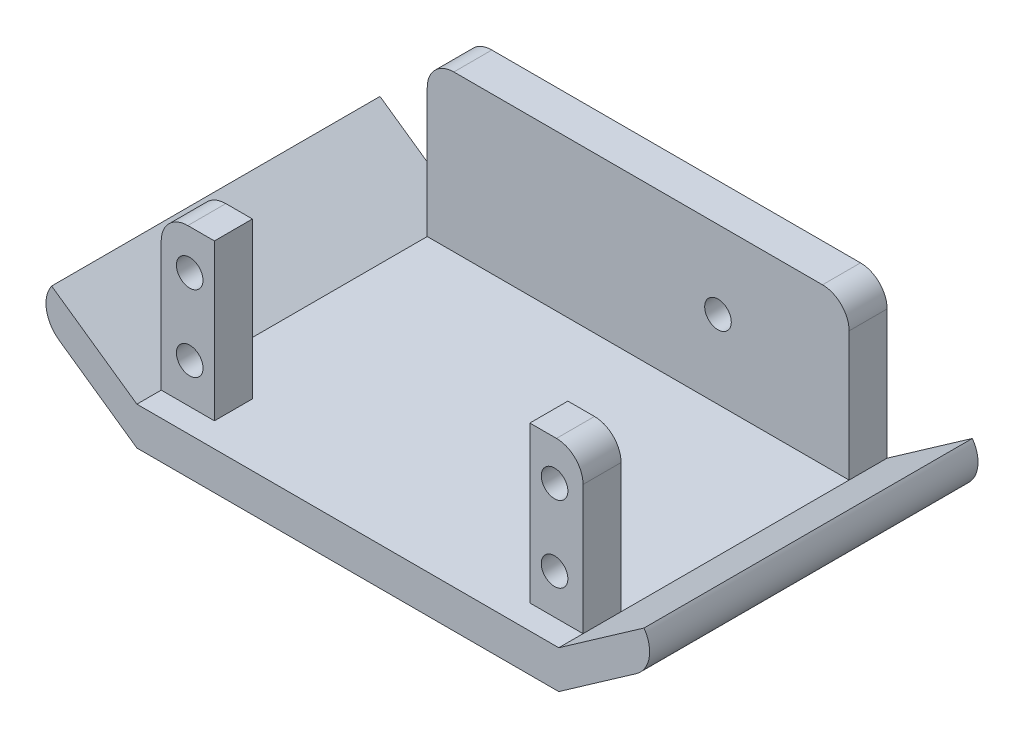
ISO-10303-21;
HEADER;
FILE_DESCRIPTION(('STEP AP214'),'2;1');
FILE_NAME('part.step','',(''),(''),'','','');
FILE_SCHEMA(('AUTOMOTIVE_DESIGN { 1 0 10303 214 1 1 1 1 }'));
ENDSEC;
DATA;
#1=APPLICATION_CONTEXT('core data for automotive mechanical design processes');
#2=APPLICATION_PROTOCOL_DEFINITION('international standard','automotive_design',2000,#1);
#3=PRODUCT_CONTEXT('',#1,'mechanical');
#4=PRODUCT('Part','Part','',(#3));
#5=PRODUCT_RELATED_PRODUCT_CATEGORY('part','',(#4));
#6=PRODUCT_DEFINITION_FORMATION('','',#4);
#7=PRODUCT_DEFINITION_CONTEXT('part definition',#1,'design');
#8=PRODUCT_DEFINITION('design','',#6,#7);
#9=PRODUCT_DEFINITION_SHAPE('','',#8);
#10=(LENGTH_UNIT() NAMED_UNIT(*) SI_UNIT(.MILLI.,.METRE.));
#11=(NAMED_UNIT(*) PLANE_ANGLE_UNIT() SI_UNIT($,.RADIAN.));
#12=(NAMED_UNIT(*) SI_UNIT($,.STERADIAN.) SOLID_ANGLE_UNIT());
#13=UNCERTAINTY_MEASURE_WITH_UNIT(LENGTH_MEASURE(1.E-05),#10,'distance_accuracy_value','');
#14=(GEOMETRIC_REPRESENTATION_CONTEXT(3) GLOBAL_UNCERTAINTY_ASSIGNED_CONTEXT((#13)) GLOBAL_UNIT_ASSIGNED_CONTEXT((#10,
#11,#12)) REPRESENTATION_CONTEXT('',''));
#15=CARTESIAN_POINT('',(0.,0.,0.));
#16=DIRECTION('',(0.,0.,1.));
#17=DIRECTION('',(1.,0.,0.));
#18=AXIS2_PLACEMENT_3D('',#15,#16,#17);
#19=CARTESIAN_POINT('',(55.5,5.,0.));
#20=DIRECTION('',(-1.,0.,0.));
#21=DIRECTION('',(0.,0.,1.));
#22=AXIS2_PLACEMENT_3D('',#19,#20,#21);
#23=PLANE('',#22);
#24=DIRECTION('',(0.,-1.,0.));
#25=VECTOR('',#24,1.);
#26=CARTESIAN_POINT('',(55.5,5.,-43.2));
#27=LINE('',#26,#25);
#28=CARTESIAN_POINT('',(55.5,22.,-43.2));
#29=VERTEX_POINT('',#28);
#30=CARTESIAN_POINT('',(55.5,5.,-43.2));
#31=VERTEX_POINT('',#30);
#32=EDGE_CURVE('E230',#29,#31,#27,.T.);
#33=ORIENTED_EDGE('',*,*,#32,.F.);
#34=DIRECTION('',(0.,0.,-1.));
#35=VECTOR('',#34,1.);
#36=CARTESIAN_POINT('',(55.5,22.,-38.2));
#37=LINE('',#36,#35);
#38=CARTESIAN_POINT('',(55.5,22.,-38.2));
#39=VERTEX_POINT('',#38);
#40=EDGE_CURVE('E244',#29,#39,#37,.F.);
#41=ORIENTED_EDGE('',*,*,#40,.T.);
#42=DIRECTION('',(0.,-1.,0.));
#43=VECTOR('',#42,1.);
#44=CARTESIAN_POINT('',(55.5,0.,-38.2));
#45=LINE('',#44,#43);
#46=CARTESIAN_POINT('',(55.5,5.,-38.2));
#47=VERTEX_POINT('',#46);
#48=EDGE_CURVE('E300',#39,#47,#45,.T.);
#49=ORIENTED_EDGE('',*,*,#48,.T.);
#50=DIRECTION('',(0.,0.,1.));
#51=VECTOR('',#50,1.);
#52=CARTESIAN_POINT('',(55.5,5.,-60.7564078321223));
#53=LINE('',#52,#51);
#54=EDGE_CURVE('E458',#31,#47,#53,.T.);
#55=ORIENTED_EDGE('',*,*,#54,.F.);
#56=EDGE_LOOP('',(#33,#41,#49,#55));
#57=FACE_BOUND('',#56,.T.);
#58=ADVANCED_FACE('F39',(#57),#23,.F.);
#59=DIRECTION('',(0.,1.,0.));
#60=VECTOR('',#59,1.);
#61=CARTESIAN_POINT('',(55.5,25.5,-8.20000000000001));
#62=LINE('',#61,#60);
#63=CARTESIAN_POINT('',(55.5,5.,-8.2));
#64=VERTEX_POINT('',#63);
#65=CARTESIAN_POINT('',(55.5,22.,-8.20000000000001));
#66=VERTEX_POINT('',#65);
#67=EDGE_CURVE('E356',#64,#66,#62,.T.);
#68=ORIENTED_EDGE('',*,*,#67,.T.);
#69=DIRECTION('',(0.,0.,-1.));
#70=VECTOR('',#69,1.);
#71=CARTESIAN_POINT('',(55.5,22.,0.));
#72=LINE('',#71,#70);
#73=CARTESIAN_POINT('',(55.5,22.,-3.20000000000001));
#74=VERTEX_POINT('',#73);
#75=EDGE_CURVE('E255',#66,#74,#72,.F.);
#76=ORIENTED_EDGE('',*,*,#75,.T.);
#77=DIRECTION('',(0.,1.,0.));
#78=VECTOR('',#77,1.);
#79=CARTESIAN_POINT('',(55.5,25.5,-3.20000000000001));
#80=LINE('',#79,#78);
#81=CARTESIAN_POINT('',(55.5,5.,-3.20000000000001));
#82=VERTEX_POINT('',#81);
#83=EDGE_CURVE('E357',#82,#74,#80,.T.);
#84=ORIENTED_EDGE('',*,*,#83,.F.);
#85=EDGE_CURVE('E237',#64,#82,#53,.T.);
#86=ORIENTED_EDGE('',*,*,#85,.F.);
#87=EDGE_LOOP('',(#68,#76,#84,#86));
#88=FACE_BOUND('',#87,.T.);
#89=ADVANCED_FACE('F398',(#88),#23,.F.);
#90=CARTESIAN_POINT('',(0.,5.,0.));
#91=DIRECTION('',(1.,0.,0.));
#92=DIRECTION('',(0.,0.,-1.));
#93=AXIS2_PLACEMENT_3D('',#90,#91,#92);
#94=PLANE('',#93);
#95=DIRECTION('',(0.,1.,0.));
#96=VECTOR('',#95,1.);
#97=CARTESIAN_POINT('',(0.,0.,-38.2));
#98=LINE('',#97,#96);
#99=CARTESIAN_POINT('',(0.,5.,-38.2));
#100=VERTEX_POINT('',#99);
#101=CARTESIAN_POINT('',(0.,22.,-38.2));
#102=VERTEX_POINT('',#101);
#103=EDGE_CURVE('E302',#100,#102,#98,.T.);
#104=ORIENTED_EDGE('',*,*,#103,.T.);
#105=DIRECTION('',(0.,0.,-1.));
#106=VECTOR('',#105,1.);
#107=CARTESIAN_POINT('',(0.,22.,-43.2));
#108=LINE('',#107,#106);
#109=CARTESIAN_POINT('',(0.,22.,-43.2));
#110=VERTEX_POINT('',#109);
#111=EDGE_CURVE('E259',#102,#110,#108,.T.);
#112=ORIENTED_EDGE('',*,*,#111,.T.);
#113=DIRECTION('',(0.,-1.,0.));
#114=VECTOR('',#113,1.);
#115=CARTESIAN_POINT('',(0.,5.,-43.2));
#116=LINE('',#115,#114);
#117=CARTESIAN_POINT('',(0.,5.,-43.2));
#118=VERTEX_POINT('',#117);
#119=EDGE_CURVE('E228',#110,#118,#116,.T.);
#120=ORIENTED_EDGE('',*,*,#119,.T.);
#121=DIRECTION('',(0.,0.,1.));
#122=VECTOR('',#121,1.);
#123=CARTESIAN_POINT('',(0.,5.,-60.7564078321223));
#124=LINE('',#123,#122);
#125=EDGE_CURVE('E348',#118,#100,#124,.T.);
#126=ORIENTED_EDGE('',*,*,#125,.T.);
#127=EDGE_LOOP('',(#104,#112,#120,#126));
#128=FACE_BOUND('',#127,.T.);
#129=ADVANCED_FACE('F405',(#128),#94,.F.);
#130=CARTESIAN_POINT('',(0.,5.,0.));
#131=DIRECTION('',(0.,-1.,0.));
#132=DIRECTION('',(0.,0.,-1.));
#133=AXIS2_PLACEMENT_3D('',#130,#131,#132);
#134=PLANE('',#133);
#135=DIRECTION('',(1.,0.,0.));
#136=VECTOR('',#135,1.);
#137=CARTESIAN_POINT('',(55.5,5.,-3.20000000000001));
#138=LINE('',#137,#136);
#139=CARTESIAN_POINT('',(48.5,5.,-3.20000000000001));
#140=VERTEX_POINT('',#139);
#141=EDGE_CURVE('E365',#140,#82,#138,.T.);
#142=ORIENTED_EDGE('',*,*,#141,.F.);
#143=DIRECTION('',(0.,0.,-1.));
#144=VECTOR('',#143,1.);
#145=CARTESIAN_POINT('',(48.5,5.,-3.20000000000001));
#146=LINE('',#145,#144);
#147=CARTESIAN_POINT('',(48.5,5.,-8.20000000000001));
#148=VERTEX_POINT('',#147);
#149=EDGE_CURVE('E284',#140,#148,#146,.T.);
#150=ORIENTED_EDGE('',*,*,#149,.T.);
#151=DIRECTION('',(1.,0.,0.));
#152=VECTOR('',#151,1.);
#153=CARTESIAN_POINT('',(55.5,5.,-8.20000000000001));
#154=LINE('',#153,#152);
#155=EDGE_CURVE('E361',#148,#64,#154,.T.);
#156=ORIENTED_EDGE('',*,*,#155,.T.);
#157=DIRECTION('',(0.,0.,-1.));
#158=VECTOR('',#157,1.);
#159=CARTESIAN_POINT('',(55.5,5.,0.));
#160=LINE('',#159,#158);
#161=EDGE_CURVE('E319',#64,#47,#160,.T.);
#162=ORIENTED_EDGE('',*,*,#161,.T.);
#163=DIRECTION('',(-1.,0.,0.));
#164=VECTOR('',#163,1.);
#165=CARTESIAN_POINT('',(0.,5.,-38.2));
#166=LINE('',#165,#164);
#167=EDGE_CURVE('E308',#47,#100,#166,.T.);
#168=ORIENTED_EDGE('',*,*,#167,.T.);
#169=DIRECTION('',(0.,0.,1.));
#170=VECTOR('',#169,1.);
#171=CARTESIAN_POINT('',(0.,5.,0.));
#172=LINE('',#171,#170);
#173=CARTESIAN_POINT('',(0.,5.,-8.20000000000001));
#174=VERTEX_POINT('',#173);
#175=EDGE_CURVE('E313',#100,#174,#172,.T.);
#176=ORIENTED_EDGE('',*,*,#175,.T.);
#177=DIRECTION('',(1.,0.,0.));
#178=VECTOR('',#177,1.);
#179=CARTESIAN_POINT('',(0.,5.,-8.20000000000001));
#180=LINE('',#179,#178);
#181=CARTESIAN_POINT('',(7.,5.,-8.20000000000001));
#182=VERTEX_POINT('',#181);
#183=EDGE_CURVE('E278',#174,#182,#180,.T.);
#184=ORIENTED_EDGE('',*,*,#183,.T.);
#185=DIRECTION('',(0.,0.,-1.));
#186=VECTOR('',#185,1.);
#187=CARTESIAN_POINT('',(7.,5.,-3.20000000000001));
#188=LINE('',#187,#186);
#189=CARTESIAN_POINT('',(7.,5.,-3.20000000000001));
#190=VERTEX_POINT('',#189);
#191=EDGE_CURVE('E296',#190,#182,#188,.T.);
#192=ORIENTED_EDGE('',*,*,#191,.F.);
#193=DIRECTION('',(1.,0.,0.));
#194=VECTOR('',#193,1.);
#195=CARTESIAN_POINT('',(0.,5.,-3.20000000000001));
#196=LINE('',#195,#194);
#197=CARTESIAN_POINT('',(0.,5.,-3.20000000000001));
#198=VERTEX_POINT('',#197);
#199=EDGE_CURVE('E379',#198,#190,#196,.T.);
#200=ORIENTED_EDGE('',*,*,#199,.F.);
#201=CARTESIAN_POINT('',(0.,5.,0.));
#202=VERTEX_POINT('',#201);
#203=EDGE_CURVE('E224',#198,#202,#172,.T.);
#204=ORIENTED_EDGE('',*,*,#203,.T.);
#205=DIRECTION('',(1.,0.,0.));
#206=VECTOR('',#205,1.);
#207=CARTESIAN_POINT('',(0.,5.,0.));
#208=LINE('',#207,#206);
#209=CARTESIAN_POINT('',(55.5,5.,0.));
#210=VERTEX_POINT('',#209);
#211=EDGE_CURVE('E316',#202,#210,#208,.T.);
#212=ORIENTED_EDGE('',*,*,#211,.T.);
#213=EDGE_CURVE('E231',#210,#82,#160,.T.);
#214=ORIENTED_EDGE('',*,*,#213,.T.);
#215=EDGE_LOOP('',(#142,#150,#156,#162,#168,#176,#184,#192,#200,#204,#212,#214));
#216=FACE_BOUND('',#215,.T.);
#217=ADVANCED_FACE('F415',(#216),#134,.F.);
#218=DIRECTION('',(0.,-1.,0.));
#219=VECTOR('',#218,1.);
#220=CARTESIAN_POINT('',(0.,25.5,-3.20000000000001));
#221=LINE('',#220,#219);
#222=CARTESIAN_POINT('',(0.,22.,-3.20000000000001));
#223=VERTEX_POINT('',#222);
#224=EDGE_CURVE('E272',#223,#198,#221,.T.);
#225=ORIENTED_EDGE('',*,*,#224,.F.);
#226=DIRECTION('',(0.,0.,-1.));
#227=VECTOR('',#226,1.);
#228=CARTESIAN_POINT('',(0.,22.,0.));
#229=LINE('',#228,#227);
#230=CARTESIAN_POINT('',(0.,22.,-8.20000000000001));
#231=VERTEX_POINT('',#230);
#232=EDGE_CURVE('E262',#223,#231,#229,.T.);
#233=ORIENTED_EDGE('',*,*,#232,.T.);
#234=DIRECTION('',(0.,-1.,0.));
#235=VECTOR('',#234,1.);
#236=CARTESIAN_POINT('',(0.,25.5,-8.20000000000001));
#237=LINE('',#236,#235);
#238=EDGE_CURVE('E270',#231,#174,#237,.T.);
#239=ORIENTED_EDGE('',*,*,#238,.T.);
#240=EDGE_CURVE('E233',#174,#198,#124,.T.);
#241=ORIENTED_EDGE('',*,*,#240,.T.);
#242=EDGE_LOOP('',(#225,#233,#239,#241));
#243=FACE_BOUND('',#242,.T.);
#244=ADVANCED_FACE('F268',(#243),#94,.F.);
#245=CARTESIAN_POINT('',(0.,5.,0.));
#246=DIRECTION('',(0.,0.,-1.));
#247=DIRECTION('',(-1.,0.,0.));
#248=AXIS2_PLACEMENT_3D('',#245,#246,#247);
#249=PLANE('',#248);
#250=DIRECTION('',(1.,0.,0.));
#251=VECTOR('',#250,1.);
#252=CARTESIAN_POINT('',(0.,0.,0.));
#253=LINE('',#252,#251);
#254=CARTESIAN_POINT('',(0.,0.,0.));
#255=VERTEX_POINT('',#254);
#256=CARTESIAN_POINT('',(55.5,0.,0.));
#257=VERTEX_POINT('',#256);
#258=EDGE_CURVE('E211',#255,#257,#253,.T.);
#259=ORIENTED_EDGE('',*,*,#258,.T.);
#260=DIRECTION('',(0.819152044288995,0.573576436351042,0.));
#261=VECTOR('',#260,1.);
#262=CARTESIAN_POINT('',(55.5,0.,0.));
#263=LINE('',#262,#261);
#264=CARTESIAN_POINT('',(65.7088844777185,7.14833786801052,0.));
#265=VERTEX_POINT('',#264);
#266=EDGE_CURVE('E194',#257,#265,#263,.T.);
#267=ORIENTED_EDGE('',*,*,#266,.T.);
#268=CARTESIAN_POINT('',(63.3572210864302,10.5068612528074,0.));
#269=DIRECTION('',(0.,0.,1.));
#270=DIRECTION('',(-1.,0.,0.));
#271=AXIS2_PLACEMENT_3D('',#268,#269,#270);
#272=CIRCLE('',#271,4.10000000392109);
#273=CARTESIAN_POINT('',(66.7181745148335,12.8550503602383,0.));
#274=VERTEX_POINT('',#273);
#275=EDGE_CURVE('E206',#265,#274,#272,.T.);
#276=ORIENTED_EDGE('',*,*,#275,.T.);
#277=DIRECTION('',(-0.819152044288995,-0.573576436351041,0.));
#278=VECTOR('',#277,1.);
#279=CARTESIAN_POINT('',(55.5,5.,0.));
#280=LINE('',#279,#278);
#281=EDGE_CURVE('E453',#274,#210,#280,.T.);
#282=ORIENTED_EDGE('',*,*,#281,.T.);
#283=ORIENTED_EDGE('',*,*,#211,.F.);
#284=DIRECTION('',(-0.819152044288995,0.573576436351041,0.));
#285=VECTOR('',#284,1.);
#286=CARTESIAN_POINT('',(0.,5.,0.));
#287=LINE('',#286,#285);
#288=CARTESIAN_POINT('',(-11.2181745148335,12.8550503602383,0.));
#289=VERTEX_POINT('',#288);
#290=EDGE_CURVE('E335',#202,#289,#287,.T.);
#291=ORIENTED_EDGE('',*,*,#290,.T.);
#292=CARTESIAN_POINT('',(-7.85722108643022,10.5068612528074,0.));
#293=DIRECTION('',(0.,0.,1.));
#294=DIRECTION('',(1.,0.,0.));
#295=AXIS2_PLACEMENT_3D('',#292,#293,#294);
#296=CIRCLE('',#295,4.10000000392109);
#297=CARTESIAN_POINT('',(-10.2088844777185,7.14833786801052,0.));
#298=VERTEX_POINT('',#297);
#299=EDGE_CURVE('E339',#289,#298,#296,.T.);
#300=ORIENTED_EDGE('',*,*,#299,.T.);
#301=DIRECTION('',(0.819152044288995,-0.573576436351041,0.));
#302=VECTOR('',#301,1.);
#303=CARTESIAN_POINT('',(0.,0.,0.));
#304=LINE('',#303,#302);
#305=EDGE_CURVE('E215',#298,#255,#304,.T.);
#306=ORIENTED_EDGE('',*,*,#305,.T.);
#307=EDGE_LOOP('',(#259,#267,#276,#282,#283,#291,#300,#306));
#308=FACE_BOUND('',#307,.T.);
#309=ADVANCED_FACE('F212',(#308),#249,.F.);
#310=CARTESIAN_POINT('',(0.,5.,-43.2));
#311=DIRECTION('',(0.,0.,1.));
#312=DIRECTION('',(1.,0.,0.));
#313=AXIS2_PLACEMENT_3D('',#310,#311,#312);
#314=PLANE('',#313);
#315=CARTESIAN_POINT('',(38.25,15.25,-43.2));
#316=DIRECTION('',(0.,0.,1.));
#317=DIRECTION('',(1.,0.,0.));
#318=AXIS2_PLACEMENT_3D('',#315,#316,#317);
#319=CIRCLE('',#318,1.75);
#320=CARTESIAN_POINT('',(40.,15.25,-43.2));
#321=VERTEX_POINT('',#320);
#322=EDGE_CURVE('E536',#321,#321,#319,.T.);
#323=ORIENTED_EDGE('',*,*,#322,.T.);
#324=EDGE_LOOP('',(#323));
#325=FACE_BOUND('',#324,.T.);
#326=DIRECTION('',(1.,0.,0.));
#327=VECTOR('',#326,1.);
#328=CARTESIAN_POINT('',(55.5,25.5,-43.2));
#329=LINE('',#328,#327);
#330=CARTESIAN_POINT('',(3.5,25.5,-43.2));
#331=VERTEX_POINT('',#330);
#332=CARTESIAN_POINT('',(52.,25.5,-43.2));
#333=VERTEX_POINT('',#332);
#334=EDGE_CURVE('E299',#331,#333,#329,.T.);
#335=ORIENTED_EDGE('',*,*,#334,.T.);
#336=CARTESIAN_POINT('',(52.,22.,-43.2));
#337=DIRECTION('',(0.,0.,1.));
#338=DIRECTION('',(1.,0.,0.));
#339=AXIS2_PLACEMENT_3D('',#336,#337,#338);
#340=CIRCLE('',#339,3.5);
#341=EDGE_CURVE('E242',#333,#29,#340,.F.);
#342=ORIENTED_EDGE('',*,*,#341,.T.);
#343=ORIENTED_EDGE('',*,*,#32,.T.);
#344=DIRECTION('',(0.819152044288995,0.573576436351041,0.));
#345=VECTOR('',#344,1.);
#346=CARTESIAN_POINT('',(55.5,5.,-43.2));
#347=LINE('',#346,#345);
#348=CARTESIAN_POINT('',(66.7181745148335,12.8550503602383,-43.2));
#349=VERTEX_POINT('',#348);
#350=EDGE_CURVE('E336',#31,#349,#347,.T.);
#351=ORIENTED_EDGE('',*,*,#350,.T.);
#352=CARTESIAN_POINT('',(63.3572210864302,10.5068612528074,-43.2));
#353=DIRECTION('',(0.,0.,1.));
#354=DIRECTION('',(1.,0.,0.));
#355=AXIS2_PLACEMENT_3D('',#352,#353,#354);
#356=CIRCLE('',#355,4.10000000392109);
#357=CARTESIAN_POINT('',(65.7088844777185,7.14833786801052,-43.2));
#358=VERTEX_POINT('',#357);
#359=EDGE_CURVE('E334',#349,#358,#356,.F.);
#360=ORIENTED_EDGE('',*,*,#359,.T.);
#361=DIRECTION('',(-0.819152044288995,-0.573576436351042,0.));
#362=VECTOR('',#361,1.);
#363=CARTESIAN_POINT('',(55.5,0.,-43.2));
#364=LINE('',#363,#362);
#365=CARTESIAN_POINT('',(55.5,0.,-43.2));
#366=VERTEX_POINT('',#365);
#367=EDGE_CURVE('E332',#358,#366,#364,.T.);
#368=ORIENTED_EDGE('',*,*,#367,.T.);
#369=DIRECTION('',(-1.,0.,0.));
#370=VECTOR('',#369,1.);
#371=CARTESIAN_POINT('',(0.,0.,-43.2));
#372=LINE('',#371,#370);
#373=CARTESIAN_POINT('',(0.,0.,-43.2));
#374=VERTEX_POINT('',#373);
#375=EDGE_CURVE('E222',#366,#374,#372,.T.);
#376=ORIENTED_EDGE('',*,*,#375,.T.);
#377=DIRECTION('',(-0.819152044288995,0.573576436351041,0.));
#378=VECTOR('',#377,1.);
#379=CARTESIAN_POINT('',(0.,0.,-43.2));
#380=LINE('',#379,#378);
#381=CARTESIAN_POINT('',(-10.2088844777185,7.14833786801052,-43.2));
#382=VERTEX_POINT('',#381);
#383=EDGE_CURVE('E324',#374,#382,#380,.T.);
#384=ORIENTED_EDGE('',*,*,#383,.T.);
#385=CARTESIAN_POINT('',(-7.85722108643022,10.5068612528074,-43.2));
#386=DIRECTION('',(0.,0.,1.));
#387=DIRECTION('',(1.,0.,0.));
#388=AXIS2_PLACEMENT_3D('',#385,#386,#387);
#389=CIRCLE('',#388,4.10000000392109);
#390=CARTESIAN_POINT('',(-11.2181745148335,12.8550503602383,-43.2));
#391=VERTEX_POINT('',#390);
#392=EDGE_CURVE('E329',#382,#391,#389,.F.);
#393=ORIENTED_EDGE('',*,*,#392,.T.);
#394=DIRECTION('',(0.819152044288995,-0.573576436351041,0.));
#395=VECTOR('',#394,1.);
#396=CARTESIAN_POINT('',(0.,5.,-43.2));
#397=LINE('',#396,#395);
#398=EDGE_CURVE('E328',#391,#118,#397,.T.);
#399=ORIENTED_EDGE('',*,*,#398,.T.);
#400=ORIENTED_EDGE('',*,*,#119,.F.);
#401=CARTESIAN_POINT('',(3.5,22.,-43.2));
#402=DIRECTION('',(0.,0.,1.));
#403=DIRECTION('',(1.,0.,0.));
#404=AXIS2_PLACEMENT_3D('',#401,#402,#403);
#405=CIRCLE('',#404,3.5);
#406=EDGE_CURVE('E240',#110,#331,#405,.F.);
#407=ORIENTED_EDGE('',*,*,#406,.T.);
#408=EDGE_LOOP('',(#335,#342,#343,#351,#360,#368,#376,#384,#393,#399,#400,#407));
#409=FACE_BOUND('',#408,.T.);
#410=ADVANCED_FACE('F331',(#325,#409),#314,.F.);
#411=CARTESIAN_POINT('',(0.,0.,0.));
#412=DIRECTION('',(0.,-1.,0.));
#413=DIRECTION('',(0.,0.,-1.));
#414=AXIS2_PLACEMENT_3D('',#411,#412,#413);
#415=PLANE('',#414);
#416=ORIENTED_EDGE('',*,*,#258,.F.);
#417=DIRECTION('',(0.,0.,1.));
#418=VECTOR('',#417,1.);
#419=CARTESIAN_POINT('',(0.,0.,0.));
#420=LINE('',#419,#418);
#421=EDGE_CURVE('E218',#374,#255,#420,.T.);
#422=ORIENTED_EDGE('',*,*,#421,.F.);
#423=ORIENTED_EDGE('',*,*,#375,.F.);
#424=DIRECTION('',(0.,0.,-1.));
#425=VECTOR('',#424,1.);
#426=CARTESIAN_POINT('',(55.5,0.,0.));
#427=LINE('',#426,#425);
#428=EDGE_CURVE('E199',#257,#366,#427,.T.);
#429=ORIENTED_EDGE('',*,*,#428,.F.);
#430=EDGE_LOOP('',(#416,#422,#423,#429));
#431=FACE_BOUND('',#430,.T.);
#432=ADVANCED_FACE('F220',(#431),#415,.T.);
#433=CARTESIAN_POINT('',(0.,0.,-38.2));
#434=DIRECTION('',(0.,0.,1.));
#435=DIRECTION('',(1.,0.,0.));
#436=AXIS2_PLACEMENT_3D('',#433,#434,#435);
#437=PLANE('',#436);
#438=CARTESIAN_POINT('',(38.25,15.25,-38.2));
#439=DIRECTION('',(0.,0.,1.));
#440=DIRECTION('',(1.,0.,0.));
#441=AXIS2_PLACEMENT_3D('',#438,#439,#440);
#442=CIRCLE('',#441,1.75);
#443=CARTESIAN_POINT('',(40.,15.25,-38.2));
#444=VERTEX_POINT('',#443);
#445=EDGE_CURVE('E538',#444,#444,#442,.T.);
#446=ORIENTED_EDGE('',*,*,#445,.F.);
#447=EDGE_LOOP('',(#446));
#448=FACE_BOUND('',#447,.T.);
#449=ORIENTED_EDGE('',*,*,#48,.F.);
#450=CARTESIAN_POINT('',(52.,22.,-38.2));
#451=DIRECTION('',(0.,0.,1.));
#452=DIRECTION('',(1.,0.,0.));
#453=AXIS2_PLACEMENT_3D('',#450,#451,#452);
#454=CIRCLE('',#453,3.5);
#455=CARTESIAN_POINT('',(52.,25.5,-38.2));
#456=VERTEX_POINT('',#455);
#457=EDGE_CURVE('E248',#39,#456,#454,.T.);
#458=ORIENTED_EDGE('',*,*,#457,.T.);
#459=DIRECTION('',(1.,0.,0.));
#460=VECTOR('',#459,1.);
#461=CARTESIAN_POINT('',(55.5,25.5,-38.2));
#462=LINE('',#461,#460);
#463=CARTESIAN_POINT('',(3.5,25.5,-38.2));
#464=VERTEX_POINT('',#463);
#465=EDGE_CURVE('E305',#464,#456,#462,.T.);
#466=ORIENTED_EDGE('',*,*,#465,.F.);
#467=CARTESIAN_POINT('',(3.5,22.,-38.2));
#468=DIRECTION('',(0.,0.,1.));
#469=DIRECTION('',(1.,0.,0.));
#470=AXIS2_PLACEMENT_3D('',#467,#468,#469);
#471=CIRCLE('',#470,3.5);
#472=EDGE_CURVE('E246',#464,#102,#471,.T.);
#473=ORIENTED_EDGE('',*,*,#472,.T.);
#474=ORIENTED_EDGE('',*,*,#103,.F.);
#475=ORIENTED_EDGE('',*,*,#167,.F.);
#476=EDGE_LOOP('',(#449,#458,#466,#473,#474,#475));
#477=FACE_BOUND('',#476,.T.);
#478=ADVANCED_FACE('F469',(#448,#477),#437,.T.);
#479=CARTESIAN_POINT('',(55.5,25.5,-38.2));
#480=DIRECTION('',(0.,1.,0.));
#481=DIRECTION('',(0.,0.,1.));
#482=AXIS2_PLACEMENT_3D('',#479,#480,#481);
#483=PLANE('',#482);
#484=ORIENTED_EDGE('',*,*,#465,.T.);
#485=DIRECTION('',(0.,0.,-1.));
#486=VECTOR('',#485,1.);
#487=CARTESIAN_POINT('',(52.,25.5,-43.2));
#488=LINE('',#487,#486);
#489=EDGE_CURVE('E236',#456,#333,#488,.T.);
#490=ORIENTED_EDGE('',*,*,#489,.T.);
#491=ORIENTED_EDGE('',*,*,#334,.F.);
#492=DIRECTION('',(0.,0.,-1.));
#493=VECTOR('',#492,1.);
#494=CARTESIAN_POINT('',(3.5,25.5,-38.2));
#495=LINE('',#494,#493);
#496=EDGE_CURVE('E234',#331,#464,#495,.F.);
#497=ORIENTED_EDGE('',*,*,#496,.T.);
#498=EDGE_LOOP('',(#484,#490,#491,#497));
#499=FACE_BOUND('',#498,.T.);
#500=ADVANCED_FACE('F475',(#499),#483,.T.);
#501=CARTESIAN_POINT('',(7.,25.5,-3.20000000000001));
#502=DIRECTION('',(-1.,0.,0.));
#503=DIRECTION('',(0.,-1.,0.));
#504=AXIS2_PLACEMENT_3D('',#501,#502,#503);
#505=PLANE('',#504);
#506=DIRECTION('',(0.,1.,0.));
#507=VECTOR('',#506,1.);
#508=CARTESIAN_POINT('',(7.,25.5,-8.20000000000001));
#509=LINE('',#508,#507);
#510=CARTESIAN_POINT('',(7.,25.5,-8.20000000000001));
#511=VERTEX_POINT('',#510);
#512=EDGE_CURVE('E281',#182,#511,#509,.T.);
#513=ORIENTED_EDGE('',*,*,#512,.T.);
#514=DIRECTION('',(0.,0.,-1.));
#515=VECTOR('',#514,1.);
#516=CARTESIAN_POINT('',(7.,25.5,-3.20000000000001));
#517=LINE('',#516,#515);
#518=CARTESIAN_POINT('',(7.,25.5,-3.20000000000001));
#519=VERTEX_POINT('',#518);
#520=EDGE_CURVE('E293',#519,#511,#517,.T.);
#521=ORIENTED_EDGE('',*,*,#520,.F.);
#522=DIRECTION('',(0.,1.,0.));
#523=VECTOR('',#522,1.);
#524=CARTESIAN_POINT('',(7.,25.5,-3.20000000000001));
#525=LINE('',#524,#523);
#526=EDGE_CURVE('E381',#190,#519,#525,.T.);
#527=ORIENTED_EDGE('',*,*,#526,.F.);
#528=ORIENTED_EDGE('',*,*,#191,.T.);
#529=EDGE_LOOP('',(#513,#521,#527,#528));
#530=FACE_BOUND('',#529,.T.);
#531=ADVANCED_FACE('F515',(#530),#505,.F.);
#532=CARTESIAN_POINT('',(0.,25.5,-3.20000000000001));
#533=DIRECTION('',(0.,-1.,0.));
#534=DIRECTION('',(0.,0.,-1.));
#535=AXIS2_PLACEMENT_3D('',#532,#533,#534);
#536=PLANE('',#535);
#537=DIRECTION('',(-1.,0.,0.));
#538=VECTOR('',#537,1.);
#539=CARTESIAN_POINT('',(0.,25.5,-8.20000000000001));
#540=LINE('',#539,#538);
#541=CARTESIAN_POINT('',(3.5,25.5,-8.20000000000001));
#542=VERTEX_POINT('',#541);
#543=EDGE_CURVE('E291',#511,#542,#540,.T.);
#544=ORIENTED_EDGE('',*,*,#543,.T.);
#545=DIRECTION('',(0.,0.,-1.));
#546=VECTOR('',#545,1.);
#547=CARTESIAN_POINT('',(3.5,25.5,-3.20000000000001));
#548=LINE('',#547,#546);
#549=CARTESIAN_POINT('',(3.5,25.5,-3.20000000000001));
#550=VERTEX_POINT('',#549);
#551=EDGE_CURVE('E47',#542,#550,#548,.F.);
#552=ORIENTED_EDGE('',*,*,#551,.T.);
#553=DIRECTION('',(-1.,0.,0.));
#554=VECTOR('',#553,1.);
#555=CARTESIAN_POINT('',(0.,25.5,-3.20000000000001));
#556=LINE('',#555,#554);
#557=EDGE_CURVE('E287',#519,#550,#556,.T.);
#558=ORIENTED_EDGE('',*,*,#557,.F.);
#559=ORIENTED_EDGE('',*,*,#520,.T.);
#560=EDGE_LOOP('',(#544,#552,#558,#559));
#561=FACE_BOUND('',#560,.T.);
#562=ADVANCED_FACE('F508',(#561),#536,.F.);
#563=CARTESIAN_POINT('',(0.,0.,-3.20000000000001));
#564=DIRECTION('',(0.,0.,1.));
#565=DIRECTION('',(1.,0.,0.));
#566=AXIS2_PLACEMENT_3D('',#563,#564,#565);
#567=PLANE('',#566);
#568=CARTESIAN_POINT('',(3.75,10.25,-3.20000000000001));
#569=DIRECTION('',(0.,0.,1.));
#570=DIRECTION('',(-1.,0.,0.));
#571=AXIS2_PLACEMENT_3D('',#568,#569,#570);
#572=CIRCLE('',#571,1.75);
#573=CARTESIAN_POINT('',(2.,10.25,-3.20000000000001));
#574=VERTEX_POINT('',#573);
#575=EDGE_CURVE('E550',#574,#574,#572,.T.);
#576=ORIENTED_EDGE('',*,*,#575,.F.);
#577=EDGE_LOOP('',(#576));
#578=FACE_BOUND('',#577,.T.);
#579=CARTESIAN_POINT('',(3.75,20.25,-3.20000000000001));
#580=DIRECTION('',(0.,0.,1.));
#581=DIRECTION('',(1.,0.,0.));
#582=AXIS2_PLACEMENT_3D('',#579,#580,#581);
#583=CIRCLE('',#582,1.75);
#584=CARTESIAN_POINT('',(5.5,20.25,-3.20000000000001));
#585=VERTEX_POINT('',#584);
#586=EDGE_CURVE('E549',#585,#585,#583,.T.);
#587=ORIENTED_EDGE('',*,*,#586,.F.);
#588=EDGE_LOOP('',(#587));
#589=FACE_BOUND('',#588,.T.);
#590=ORIENTED_EDGE('',*,*,#557,.T.);
#591=CARTESIAN_POINT('',(3.5,22.,-3.20000000000001));
#592=DIRECTION('',(0.,0.,1.));
#593=DIRECTION('',(1.,0.,0.));
#594=AXIS2_PLACEMENT_3D('',#591,#592,#593);
#595=CIRCLE('',#594,3.5);
#596=EDGE_CURVE('E11',#550,#223,#595,.T.);
#597=ORIENTED_EDGE('',*,*,#596,.T.);
#598=ORIENTED_EDGE('',*,*,#224,.T.);
#599=ORIENTED_EDGE('',*,*,#199,.T.);
#600=ORIENTED_EDGE('',*,*,#526,.T.);
#601=EDGE_LOOP('',(#590,#597,#598,#599,#600));
#602=FACE_BOUND('',#601,.T.);
#603=ADVANCED_FACE('F385',(#578,#589,#602),#567,.T.);
#604=CARTESIAN_POINT('',(0.,0.,-8.20000000000001));
#605=DIRECTION('',(0.,0.,1.));
#606=DIRECTION('',(1.,0.,0.));
#607=AXIS2_PLACEMENT_3D('',#604,#605,#606);
#608=PLANE('',#607);
#609=CARTESIAN_POINT('',(3.75,10.25,-8.20000000000001));
#610=DIRECTION('',(0.,0.,1.));
#611=DIRECTION('',(-1.,0.,0.));
#612=AXIS2_PLACEMENT_3D('',#609,#610,#611);
#613=CIRCLE('',#612,1.75);
#614=CARTESIAN_POINT('',(2.,10.25,-8.20000000000001));
#615=VERTEX_POINT('',#614);
#616=EDGE_CURVE('E546',#615,#615,#613,.T.);
#617=ORIENTED_EDGE('',*,*,#616,.T.);
#618=EDGE_LOOP('',(#617));
#619=FACE_BOUND('',#618,.T.);
#620=CARTESIAN_POINT('',(3.75,20.25,-8.20000000000001));
#621=DIRECTION('',(0.,0.,1.));
#622=DIRECTION('',(1.,0.,0.));
#623=AXIS2_PLACEMENT_3D('',#620,#621,#622);
#624=CIRCLE('',#623,1.75);
#625=CARTESIAN_POINT('',(5.5,20.25,-8.20000000000001));
#626=VERTEX_POINT('',#625);
#627=EDGE_CURVE('E207',#626,#626,#624,.T.);
#628=ORIENTED_EDGE('',*,*,#627,.T.);
#629=EDGE_LOOP('',(#628));
#630=FACE_BOUND('',#629,.T.);
#631=ORIENTED_EDGE('',*,*,#238,.F.);
#632=CARTESIAN_POINT('',(3.5,22.,-8.20000000000001));
#633=DIRECTION('',(0.,0.,1.));
#634=DIRECTION('',(1.,0.,0.));
#635=AXIS2_PLACEMENT_3D('',#632,#633,#634);
#636=CIRCLE('',#635,3.5);
#637=EDGE_CURVE('E61',#231,#542,#636,.F.);
#638=ORIENTED_EDGE('',*,*,#637,.T.);
#639=ORIENTED_EDGE('',*,*,#543,.F.);
#640=ORIENTED_EDGE('',*,*,#512,.F.);
#641=ORIENTED_EDGE('',*,*,#183,.F.);
#642=EDGE_LOOP('',(#631,#638,#639,#640,#641));
#643=FACE_BOUND('',#642,.T.);
#644=ADVANCED_FACE('F276',(#619,#630,#643),#608,.F.);
#645=CARTESIAN_POINT('',(55.5,25.5,-3.20000000000001));
#646=DIRECTION('',(0.,-1.,0.));
#647=DIRECTION('',(0.,0.,-1.));
#648=AXIS2_PLACEMENT_3D('',#645,#646,#647);
#649=PLANE('',#648);
#650=DIRECTION('',(-1.,0.,0.));
#651=VECTOR('',#650,1.);
#652=CARTESIAN_POINT('',(55.5,25.5,-3.20000000000001));
#653=LINE('',#652,#651);
#654=CARTESIAN_POINT('',(52.,25.5,-3.20000000000001));
#655=VERTEX_POINT('',#654);
#656=CARTESIAN_POINT('',(48.5,25.5,-3.20000000000001));
#657=VERTEX_POINT('',#656);
#658=EDGE_CURVE('E360',#655,#657,#653,.T.);
#659=ORIENTED_EDGE('',*,*,#658,.F.);
#660=DIRECTION('',(0.,0.,-1.));
#661=VECTOR('',#660,1.);
#662=CARTESIAN_POINT('',(52.,25.5,-3.20000000000001));
#663=LINE('',#662,#661);
#664=CARTESIAN_POINT('',(52.,25.5,-8.20000000000001));
#665=VERTEX_POINT('',#664);
#666=EDGE_CURVE('E250',#655,#665,#663,.T.);
#667=ORIENTED_EDGE('',*,*,#666,.T.);
#668=DIRECTION('',(-1.,0.,0.));
#669=VECTOR('',#668,1.);
#670=CARTESIAN_POINT('',(55.5,25.5,-8.20000000000001));
#671=LINE('',#670,#669);
#672=CARTESIAN_POINT('',(48.5,25.5,-8.20000000000001));
#673=VERTEX_POINT('',#672);
#674=EDGE_CURVE('E370',#665,#673,#671,.T.);
#675=ORIENTED_EDGE('',*,*,#674,.T.);
#676=DIRECTION('',(0.,0.,-1.));
#677=VECTOR('',#676,1.);
#678=CARTESIAN_POINT('',(48.5,25.5,-3.20000000000001));
#679=LINE('',#678,#677);
#680=EDGE_CURVE('E279',#657,#673,#679,.T.);
#681=ORIENTED_EDGE('',*,*,#680,.F.);
#682=EDGE_LOOP('',(#659,#667,#675,#681));
#683=FACE_BOUND('',#682,.T.);
#684=ADVANCED_FACE('F434',(#683),#649,.F.);
#685=CARTESIAN_POINT('',(48.5,25.5,-3.20000000000001));
#686=DIRECTION('',(1.,0.,0.));
#687=DIRECTION('',(0.,1.,0.));
#688=AXIS2_PLACEMENT_3D('',#685,#686,#687);
#689=PLANE('',#688);
#690=DIRECTION('',(0.,-1.,0.));
#691=VECTOR('',#690,1.);
#692=CARTESIAN_POINT('',(48.5,25.5,-8.20000000000001));
#693=LINE('',#692,#691);
#694=EDGE_CURVE('E372',#673,#148,#693,.T.);
#695=ORIENTED_EDGE('',*,*,#694,.T.);
#696=ORIENTED_EDGE('',*,*,#149,.F.);
#697=DIRECTION('',(0.,-1.,0.));
#698=VECTOR('',#697,1.);
#699=CARTESIAN_POINT('',(48.5,25.5,-3.20000000000001));
#700=LINE('',#699,#698);
#701=EDGE_CURVE('E363',#657,#140,#700,.T.);
#702=ORIENTED_EDGE('',*,*,#701,.F.);
#703=ORIENTED_EDGE('',*,*,#680,.T.);
#704=EDGE_LOOP('',(#695,#696,#702,#703));
#705=FACE_BOUND('',#704,.T.);
#706=ADVANCED_FACE('F440',(#705),#689,.F.);
#707=CARTESIAN_POINT('',(0.,0.,-3.20000000000001));
#708=DIRECTION('',(0.,0.,-1.));
#709=DIRECTION('',(-1.,0.,0.));
#710=AXIS2_PLACEMENT_3D('',#707,#708,#709);
#711=PLANE('',#710);
#712=CARTESIAN_POINT('',(51.75,20.25,-3.20000000000001));
#713=DIRECTION('',(0.,0.,1.));
#714=DIRECTION('',(-1.,0.,0.));
#715=AXIS2_PLACEMENT_3D('',#712,#713,#714);
#716=CIRCLE('',#715,1.75000000000001);
#717=CARTESIAN_POINT('',(50.,20.25,-3.20000000000001));
#718=VERTEX_POINT('',#717);
#719=EDGE_CURVE('E537',#718,#718,#716,.T.);
#720=ORIENTED_EDGE('',*,*,#719,.F.);
#721=EDGE_LOOP('',(#720));
#722=FACE_BOUND('',#721,.T.);
#723=CARTESIAN_POINT('',(51.75,10.25,-3.20000000000001));
#724=DIRECTION('',(0.,0.,1.));
#725=DIRECTION('',(1.,0.,0.));
#726=AXIS2_PLACEMENT_3D('',#723,#724,#725);
#727=CIRCLE('',#726,1.75000000000001);
#728=CARTESIAN_POINT('',(53.5,10.25,-3.20000000000001));
#729=VERTEX_POINT('',#728);
#730=EDGE_CURVE('E556',#729,#729,#727,.T.);
#731=ORIENTED_EDGE('',*,*,#730,.F.);
#732=EDGE_LOOP('',(#731));
#733=FACE_BOUND('',#732,.T.);
#734=ORIENTED_EDGE('',*,*,#83,.T.);
#735=CARTESIAN_POINT('',(52.,22.,-3.20000000000001));
#736=DIRECTION('',(0.,0.,-1.));
#737=DIRECTION('',(-1.,0.,0.));
#738=AXIS2_PLACEMENT_3D('',#735,#736,#737);
#739=CIRCLE('',#738,3.5);
#740=EDGE_CURVE('E257',#74,#655,#739,.F.);
#741=ORIENTED_EDGE('',*,*,#740,.T.);
#742=ORIENTED_EDGE('',*,*,#658,.T.);
#743=ORIENTED_EDGE('',*,*,#701,.T.);
#744=ORIENTED_EDGE('',*,*,#141,.T.);
#745=EDGE_LOOP('',(#734,#741,#742,#743,#744));
#746=FACE_BOUND('',#745,.T.);
#747=ADVANCED_FACE('F430',(#722,#733,#746),#711,.F.);
#748=CARTESIAN_POINT('',(0.,0.,-8.20000000000001));
#749=DIRECTION('',(0.,0.,-1.));
#750=DIRECTION('',(-1.,0.,0.));
#751=AXIS2_PLACEMENT_3D('',#748,#749,#750);
#752=PLANE('',#751);
#753=CARTESIAN_POINT('',(51.75,20.25,-8.20000000000001));
#754=DIRECTION('',(0.,0.,1.));
#755=DIRECTION('',(-1.,0.,0.));
#756=AXIS2_PLACEMENT_3D('',#753,#754,#755);
#757=CIRCLE('',#756,1.75000000000001);
#758=CARTESIAN_POINT('',(50.,20.25,-8.20000000000001));
#759=VERTEX_POINT('',#758);
#760=EDGE_CURVE('E541',#759,#759,#757,.T.);
#761=ORIENTED_EDGE('',*,*,#760,.T.);
#762=EDGE_LOOP('',(#761));
#763=FACE_BOUND('',#762,.T.);
#764=CARTESIAN_POINT('',(51.75,10.25,-8.20000000000001));
#765=DIRECTION('',(0.,0.,1.));
#766=DIRECTION('',(1.,0.,0.));
#767=AXIS2_PLACEMENT_3D('',#764,#765,#766);
#768=CIRCLE('',#767,1.75000000000001);
#769=CARTESIAN_POINT('',(53.5,10.25,-8.20000000000001));
#770=VERTEX_POINT('',#769);
#771=EDGE_CURVE('E553',#770,#770,#768,.T.);
#772=ORIENTED_EDGE('',*,*,#771,.T.);
#773=EDGE_LOOP('',(#772));
#774=FACE_BOUND('',#773,.T.);
#775=ORIENTED_EDGE('',*,*,#674,.F.);
#776=CARTESIAN_POINT('',(52.,22.,-8.20000000000001));
#777=DIRECTION('',(0.,0.,-1.));
#778=DIRECTION('',(-1.,0.,0.));
#779=AXIS2_PLACEMENT_3D('',#776,#777,#778);
#780=CIRCLE('',#779,3.5);
#781=EDGE_CURVE('E253',#665,#66,#780,.T.);
#782=ORIENTED_EDGE('',*,*,#781,.T.);
#783=ORIENTED_EDGE('',*,*,#67,.F.);
#784=ORIENTED_EDGE('',*,*,#155,.F.);
#785=ORIENTED_EDGE('',*,*,#694,.F.);
#786=EDGE_LOOP('',(#775,#782,#783,#784,#785));
#787=FACE_BOUND('',#786,.T.);
#788=ADVANCED_FACE('F486',(#763,#774,#787),#752,.T.);
#789=CARTESIAN_POINT('',(0.,0.,-60.7564078321223));
#790=DIRECTION('',(-0.573576436351041,-0.819152044288995,0.));
#791=DIRECTION('',(0.819152044288995,-0.573576436351041,0.));
#792=AXIS2_PLACEMENT_3D('',#789,#790,#791);
#793=PLANE('',#792);
#794=ORIENTED_EDGE('',*,*,#383,.F.);
#795=ORIENTED_EDGE('',*,*,#421,.T.);
#796=ORIENTED_EDGE('',*,*,#305,.F.);
#797=DIRECTION('',(0.,0.,1.));
#798=VECTOR('',#797,1.);
#799=CARTESIAN_POINT('',(-10.2088844777185,7.14833786801052,-60.7564078321223));
#800=LINE('',#799,#798);
#801=EDGE_CURVE('E325',#382,#298,#800,.T.);
#802=ORIENTED_EDGE('',*,*,#801,.F.);
#803=EDGE_LOOP('',(#794,#795,#796,#802));
#804=FACE_BOUND('',#803,.T.);
#805=ADVANCED_FACE('F322',(#804),#793,.T.);
#806=CARTESIAN_POINT('',(-7.85722108643022,10.5068612528074,-60.7564078321223));
#807=DIRECTION('',(0.,0.,1.));
#808=DIRECTION('',(1.,0.,0.));
#809=AXIS2_PLACEMENT_3D('',#806,#807,#808);
#810=CYLINDRICAL_SURFACE('',#809,4.10000000392109);
#811=ORIENTED_EDGE('',*,*,#392,.F.);
#812=ORIENTED_EDGE('',*,*,#801,.T.);
#813=ORIENTED_EDGE('',*,*,#299,.F.);
#814=DIRECTION('',(0.,0.,1.));
#815=VECTOR('',#814,1.);
#816=CARTESIAN_POINT('',(-11.2181745148335,12.8550503602383,-60.7564078321223));
#817=LINE('',#816,#815);
#818=EDGE_CURVE('E350',#391,#289,#817,.T.);
#819=ORIENTED_EDGE('',*,*,#818,.F.);
#820=EDGE_LOOP('',(#811,#812,#813,#819));
#821=FACE_BOUND('',#820,.T.);
#822=ADVANCED_FACE('F494',(#821),#810,.T.);
#823=CARTESIAN_POINT('',(0.,5.,-60.7564078321223));
#824=DIRECTION('',(0.573576436351041,0.819152044288995,0.));
#825=DIRECTION('',(-0.819152044288995,0.573576436351041,0.));
#826=AXIS2_PLACEMENT_3D('',#823,#824,#825);
#827=PLANE('',#826);
#828=ORIENTED_EDGE('',*,*,#398,.F.);
#829=ORIENTED_EDGE('',*,*,#818,.T.);
#830=ORIENTED_EDGE('',*,*,#290,.F.);
#831=ORIENTED_EDGE('',*,*,#203,.F.);
#832=ORIENTED_EDGE('',*,*,#240,.F.);
#833=ORIENTED_EDGE('',*,*,#175,.F.);
#834=ORIENTED_EDGE('',*,*,#125,.F.);
#835=EDGE_LOOP('',(#828,#829,#830,#831,#832,#833,#834));
#836=FACE_BOUND('',#835,.T.);
#837=ADVANCED_FACE('F586',(#836),#827,.T.);
#838=CARTESIAN_POINT('',(55.5,5.,-60.7564078321223));
#839=DIRECTION('',(-0.573576436351041,0.819152044288995,0.));
#840=DIRECTION('',(-0.819152044288995,-0.573576436351041,0.));
#841=AXIS2_PLACEMENT_3D('',#838,#839,#840);
#842=PLANE('',#841);
#843=ORIENTED_EDGE('',*,*,#350,.F.);
#844=ORIENTED_EDGE('',*,*,#54,.T.);
#845=ORIENTED_EDGE('',*,*,#161,.F.);
#846=ORIENTED_EDGE('',*,*,#85,.T.);
#847=ORIENTED_EDGE('',*,*,#213,.F.);
#848=ORIENTED_EDGE('',*,*,#281,.F.);
#849=DIRECTION('',(0.,0.,1.));
#850=VECTOR('',#849,1.);
#851=CARTESIAN_POINT('',(66.7181745148335,12.8550503602383,-60.7564078321223));
#852=LINE('',#851,#850);
#853=EDGE_CURVE('E455',#349,#274,#852,.T.);
#854=ORIENTED_EDGE('',*,*,#853,.F.);
#855=EDGE_LOOP('',(#843,#844,#845,#846,#847,#848,#854));
#856=FACE_BOUND('',#855,.T.);
#857=ADVANCED_FACE('F451',(#856),#842,.T.);
#858=CARTESIAN_POINT('',(63.3572210864302,10.5068612528074,-60.7564078321223));
#859=DIRECTION('',(0.,0.,1.));
#860=DIRECTION('',(1.,0.,0.));
#861=AXIS2_PLACEMENT_3D('',#858,#859,#860);
#862=CYLINDRICAL_SURFACE('',#861,4.10000000392109);
#863=ORIENTED_EDGE('',*,*,#359,.F.);
#864=ORIENTED_EDGE('',*,*,#853,.T.);
#865=ORIENTED_EDGE('',*,*,#275,.F.);
#866=DIRECTION('',(0.,0.,1.));
#867=VECTOR('',#866,1.);
#868=CARTESIAN_POINT('',(65.7088844777185,7.14833786801052,-60.7564078321223));
#869=LINE('',#868,#867);
#870=EDGE_CURVE('E202',#358,#265,#869,.T.);
#871=ORIENTED_EDGE('',*,*,#870,.F.);
#872=EDGE_LOOP('',(#863,#864,#865,#871));
#873=FACE_BOUND('',#872,.T.);
#874=ADVANCED_FACE('F461',(#873),#862,.T.);
#875=CARTESIAN_POINT('',(55.5,0.,-60.7564078321223));
#876=DIRECTION('',(0.573576436351042,-0.819152044288995,0.));
#877=DIRECTION('',(0.819152044288995,0.573576436351042,0.));
#878=AXIS2_PLACEMENT_3D('',#875,#876,#877);
#879=PLANE('',#878);
#880=ORIENTED_EDGE('',*,*,#367,.F.);
#881=ORIENTED_EDGE('',*,*,#870,.T.);
#882=ORIENTED_EDGE('',*,*,#266,.F.);
#883=ORIENTED_EDGE('',*,*,#428,.T.);
#884=EDGE_LOOP('',(#880,#881,#882,#883));
#885=FACE_BOUND('',#884,.T.);
#886=ADVANCED_FACE('F197',(#885),#879,.T.);
#887=CARTESIAN_POINT('',(51.75,10.25,-8.20000000000001));
#888=DIRECTION('',(0.,0.,1.));
#889=DIRECTION('',(1.,0.,0.));
#890=AXIS2_PLACEMENT_3D('',#887,#888,#889);
#891=CYLINDRICAL_SURFACE('',#890,1.75000000000001);
#892=ORIENTED_EDGE('',*,*,#771,.F.);
#893=EDGE_LOOP('',(#892));
#894=FACE_BOUND('',#893,.T.);
#895=ORIENTED_EDGE('',*,*,#730,.T.);
#896=EDGE_LOOP('',(#895));
#897=FACE_BOUND('',#896,.T.);
#898=ADVANCED_FACE('F578',(#894,#897),#891,.F.);
#899=CARTESIAN_POINT('',(51.75,20.25,-8.20000000000001));
#900=DIRECTION('',(0.,0.,1.));
#901=DIRECTION('',(1.,0.,0.));
#902=AXIS2_PLACEMENT_3D('',#899,#900,#901);
#903=CYLINDRICAL_SURFACE('',#902,1.75000000000001);
#904=ORIENTED_EDGE('',*,*,#760,.F.);
#905=EDGE_LOOP('',(#904));
#906=FACE_BOUND('',#905,.T.);
#907=ORIENTED_EDGE('',*,*,#719,.T.);
#908=EDGE_LOOP('',(#907));
#909=FACE_BOUND('',#908,.T.);
#910=ADVANCED_FACE('F569',(#906,#909),#903,.F.);
#911=CARTESIAN_POINT('',(3.75,20.25,-8.20000000000001));
#912=DIRECTION('',(0.,0.,1.));
#913=DIRECTION('',(1.,0.,0.));
#914=AXIS2_PLACEMENT_3D('',#911,#912,#913);
#915=CYLINDRICAL_SURFACE('',#914,1.75);
#916=ORIENTED_EDGE('',*,*,#627,.F.);
#917=EDGE_LOOP('',(#916));
#918=FACE_BOUND('',#917,.T.);
#919=ORIENTED_EDGE('',*,*,#586,.T.);
#920=EDGE_LOOP('',(#919));
#921=FACE_BOUND('',#920,.T.);
#922=ADVANCED_FACE('F566',(#918,#921),#915,.F.);
#923=CARTESIAN_POINT('',(3.75,10.25,-8.20000000000001));
#924=DIRECTION('',(0.,0.,1.));
#925=DIRECTION('',(1.,0.,0.));
#926=AXIS2_PLACEMENT_3D('',#923,#924,#925);
#927=CYLINDRICAL_SURFACE('',#926,1.75);
#928=ORIENTED_EDGE('',*,*,#616,.F.);
#929=EDGE_LOOP('',(#928));
#930=FACE_BOUND('',#929,.T.);
#931=ORIENTED_EDGE('',*,*,#575,.T.);
#932=EDGE_LOOP('',(#931));
#933=FACE_BOUND('',#932,.T.);
#934=ADVANCED_FACE('F419',(#930,#933),#927,.F.);
#935=CARTESIAN_POINT('',(52.,22.,-38.2));
#936=DIRECTION('',(0.,0.,1.));
#937=DIRECTION('',(1.,0.,0.));
#938=AXIS2_PLACEMENT_3D('',#935,#936,#937);
#939=CYLINDRICAL_SURFACE('',#938,3.5);
#940=ORIENTED_EDGE('',*,*,#457,.F.);
#941=ORIENTED_EDGE('',*,*,#40,.F.);
#942=ORIENTED_EDGE('',*,*,#341,.F.);
#943=ORIENTED_EDGE('',*,*,#489,.F.);
#944=EDGE_LOOP('',(#940,#941,#942,#943));
#945=FACE_BOUND('',#944,.T.);
#946=ADVANCED_FACE('F416',(#945),#939,.T.);
#947=CARTESIAN_POINT('',(52.,22.,-3.20000000000001));
#948=DIRECTION('',(0.,0.,-1.));
#949=DIRECTION('',(-1.,0.,0.));
#950=AXIS2_PLACEMENT_3D('',#947,#948,#949);
#951=CYLINDRICAL_SURFACE('',#950,3.5);
#952=ORIENTED_EDGE('',*,*,#740,.F.);
#953=ORIENTED_EDGE('',*,*,#75,.F.);
#954=ORIENTED_EDGE('',*,*,#781,.F.);
#955=ORIENTED_EDGE('',*,*,#666,.F.);
#956=EDGE_LOOP('',(#952,#953,#954,#955));
#957=FACE_BOUND('',#956,.T.);
#958=ADVANCED_FACE('F395',(#957),#951,.T.);
#959=CARTESIAN_POINT('',(3.5,22.,0.));
#960=DIRECTION('',(0.,0.,1.));
#961=DIRECTION('',(1.,0.,0.));
#962=AXIS2_PLACEMENT_3D('',#959,#960,#961);
#963=CYLINDRICAL_SURFACE('',#962,3.5);
#964=ORIENTED_EDGE('',*,*,#472,.F.);
#965=ORIENTED_EDGE('',*,*,#496,.F.);
#966=ORIENTED_EDGE('',*,*,#406,.F.);
#967=ORIENTED_EDGE('',*,*,#111,.F.);
#968=EDGE_LOOP('',(#964,#965,#966,#967));
#969=FACE_BOUND('',#968,.T.);
#970=ADVANCED_FACE('F388',(#969),#963,.T.);
#971=CARTESIAN_POINT('',(3.5,22.,0.));
#972=DIRECTION('',(0.,0.,-1.));
#973=DIRECTION('',(-1.,0.,0.));
#974=AXIS2_PLACEMENT_3D('',#971,#972,#973);
#975=CYLINDRICAL_SURFACE('',#974,3.5);
#976=ORIENTED_EDGE('',*,*,#596,.F.);
#977=ORIENTED_EDGE('',*,*,#551,.F.);
#978=ORIENTED_EDGE('',*,*,#637,.F.);
#979=ORIENTED_EDGE('',*,*,#232,.F.);
#980=EDGE_LOOP('',(#976,#977,#978,#979));
#981=FACE_BOUND('',#980,.T.);
#982=ADVANCED_FACE('F41',(#981),#975,.T.);
#983=CARTESIAN_POINT('',(38.25,15.25,-43.2));
#984=DIRECTION('',(0.,0.,1.));
#985=DIRECTION('',(1.,0.,0.));
#986=AXIS2_PLACEMENT_3D('',#983,#984,#985);
#987=CYLINDRICAL_SURFACE('',#986,1.75);
#988=ORIENTED_EDGE('',*,*,#322,.F.);
#989=EDGE_LOOP('',(#988));
#990=FACE_BOUND('',#989,.T.);
#991=ORIENTED_EDGE('',*,*,#445,.T.);
#992=EDGE_LOOP('',(#991));
#993=FACE_BOUND('',#992,.T.);
#994=ADVANCED_FACE('F387',(#990,#993),#987,.F.);
#995=CLOSED_SHELL('',(#58,#89,#129,#217,#244,#309,#410,#432,#478,#500,#531,#562,#603,#644,#684,
#706,#747,#788,#805,#822,#837,#857,#874,#886,#898,#910,#922,#934,#946,#958,#970,#982,#994));
#996=MANIFOLD_SOLID_BREP('B2',#995);
#997=ADVANCED_BREP_SHAPE_REPRESENTATION('',(#18,#996),#14);
#998=SHAPE_DEFINITION_REPRESENTATION(#9,#997);
ENDSEC;
END-ISO-10303-21;
